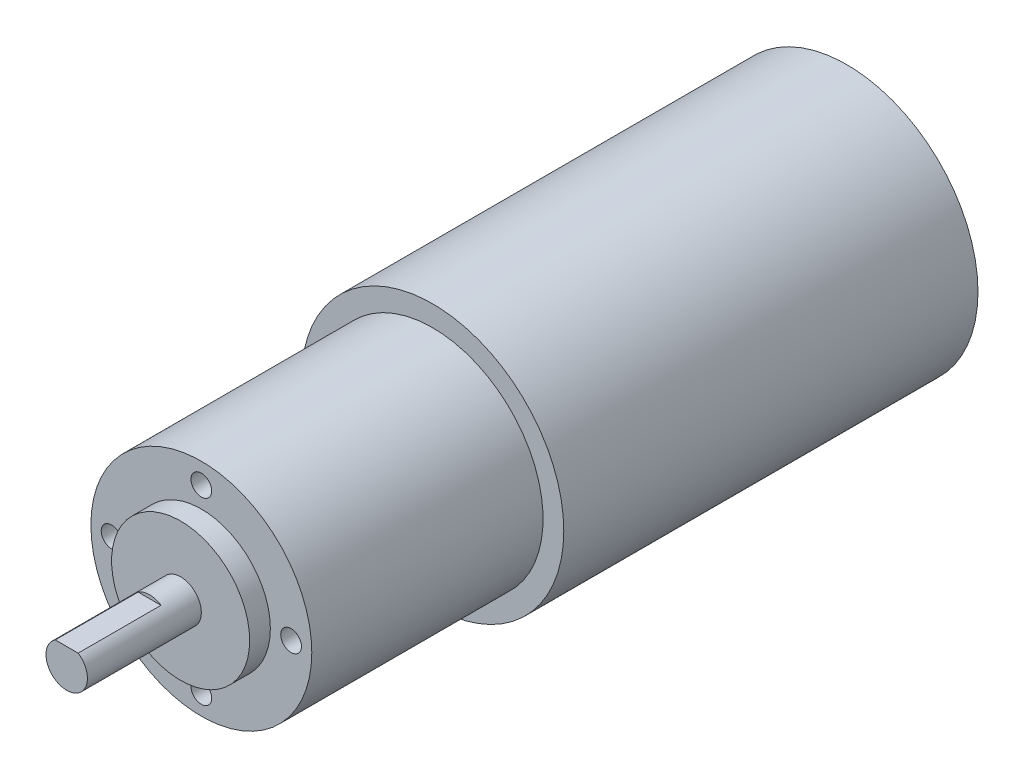
ISO-10303-21;
HEADER;
FILE_DESCRIPTION(('STEP AP214'),'2;1');
FILE_NAME('part.step','',(''),(''),'','','');
FILE_SCHEMA(('AUTOMOTIVE_DESIGN { 1 0 10303 214 1 1 1 1 }'));
ENDSEC;
DATA;
#1=APPLICATION_CONTEXT('core data for automotive mechanical design processes');
#2=APPLICATION_PROTOCOL_DEFINITION('international standard','automotive_design',2000,#1);
#3=PRODUCT_CONTEXT('',#1,'mechanical');
#4=PRODUCT('Part','Part','',(#3));
#5=PRODUCT_RELATED_PRODUCT_CATEGORY('part','',(#4));
#6=PRODUCT_DEFINITION_FORMATION('','',#4);
#7=PRODUCT_DEFINITION_CONTEXT('part definition',#1,'design');
#8=PRODUCT_DEFINITION('design','',#6,#7);
#9=PRODUCT_DEFINITION_SHAPE('','',#8);
#10=(LENGTH_UNIT() NAMED_UNIT(*) SI_UNIT(.MILLI.,.METRE.));
#11=(NAMED_UNIT(*) PLANE_ANGLE_UNIT() SI_UNIT($,.RADIAN.));
#12=(NAMED_UNIT(*) SI_UNIT($,.STERADIAN.) SOLID_ANGLE_UNIT());
#13=UNCERTAINTY_MEASURE_WITH_UNIT(LENGTH_MEASURE(1.E-05),#10,'distance_accuracy_value','');
#14=(GEOMETRIC_REPRESENTATION_CONTEXT(3) GLOBAL_UNCERTAINTY_ASSIGNED_CONTEXT((#13)) GLOBAL_UNIT_ASSIGNED_CONTEXT((#10,
#11,#12)) REPRESENTATION_CONTEXT('',''));
#15=CARTESIAN_POINT('',(0.,0.,0.));
#16=DIRECTION('',(0.,0.,1.));
#17=DIRECTION('',(1.,0.,0.));
#18=AXIS2_PLACEMENT_3D('',#15,#16,#17);
#19=CARTESIAN_POINT('',(0.,0.,53.));
#20=DIRECTION('',(0.,0.,-1.));
#21=DIRECTION('',(-1.,0.,0.));
#22=AXIS2_PLACEMENT_3D('',#19,#20,#21);
#23=CYLINDRICAL_SURFACE('',#22,3.);
#24=CARTESIAN_POINT('',(0.,0.,36.5));
#25=DIRECTION('',(0.,0.,1.));
#26=DIRECTION('',(1.,0.,0.));
#27=AXIS2_PLACEMENT_3D('',#24,#25,#26);
#28=CIRCLE('',#27,3.);
#29=CARTESIAN_POINT('',(3.,0.,36.5));
#30=VERTEX_POINT('',#29);
#31=EDGE_CURVE('E68',#30,#30,#28,.T.);
#32=ORIENTED_EDGE('',*,*,#31,.T.);
#33=EDGE_LOOP('',(#32));
#34=FACE_BOUND('',#33,.T.);
#35=DIRECTION('',(0.,0.,-1.));
#36=VECTOR('',#35,1.);
#37=CARTESIAN_POINT('',(-1.6583123951777,2.5,53.));
#38=LINE('',#37,#36);
#39=CARTESIAN_POINT('',(-1.6583123951777,2.5,41.));
#40=VERTEX_POINT('',#39);
#41=CARTESIAN_POINT('',(-1.6583123951777,2.5,53.));
#42=VERTEX_POINT('',#41);
#43=EDGE_CURVE('E49',#40,#42,#38,.F.);
#44=ORIENTED_EDGE('',*,*,#43,.F.);
#45=CARTESIAN_POINT('',(0.,0.,41.));
#46=DIRECTION('',(0.,0.,-1.));
#47=DIRECTION('',(-1.,0.,0.));
#48=AXIS2_PLACEMENT_3D('',#45,#46,#47);
#49=CIRCLE('',#48,3.);
#50=CARTESIAN_POINT('',(1.6583123951777,2.5,41.));
#51=VERTEX_POINT('',#50);
#52=EDGE_CURVE('E11',#40,#51,#49,.T.);
#53=ORIENTED_EDGE('',*,*,#52,.T.);
#54=DIRECTION('',(0.,0.,-1.));
#55=VECTOR('',#54,1.);
#56=CARTESIAN_POINT('',(1.6583123951777,2.5,53.));
#57=LINE('',#56,#55);
#58=CARTESIAN_POINT('',(1.6583123951777,2.5,53.));
#59=VERTEX_POINT('',#58);
#60=EDGE_CURVE('E61',#59,#51,#57,.T.);
#61=ORIENTED_EDGE('',*,*,#60,.F.);
#62=CARTESIAN_POINT('',(0.,0.,53.));
#63=DIRECTION('',(0.,0.,1.));
#64=DIRECTION('',(1.,0.,0.));
#65=AXIS2_PLACEMENT_3D('',#62,#63,#64);
#66=CIRCLE('',#65,3.);
#67=EDGE_CURVE('E67',#42,#59,#66,.T.);
#68=ORIENTED_EDGE('',*,*,#67,.F.);
#69=EDGE_LOOP('',(#44,#53,#61,#68));
#70=FACE_BOUND('',#69,.T.);
#71=ADVANCED_FACE('F34',(#34,#70),#23,.T.);
#72=CARTESIAN_POINT('',(0.,0.,53.));
#73=DIRECTION('',(0.,0.,1.));
#74=DIRECTION('',(1.,0.,0.));
#75=AXIS2_PLACEMENT_3D('',#72,#73,#74);
#76=PLANE('',#75);
#77=ORIENTED_EDGE('',*,*,#67,.T.);
#78=DIRECTION('',(-1.,0.,0.));
#79=VECTOR('',#78,1.);
#80=CARTESIAN_POINT('',(0.,2.5,53.));
#81=LINE('',#80,#79);
#82=EDGE_CURVE('E42',#59,#42,#81,.T.);
#83=ORIENTED_EDGE('',*,*,#82,.T.);
#84=EDGE_LOOP('',(#77,#83));
#85=FACE_BOUND('',#84,.T.);
#86=ADVANCED_FACE('F70',(#85),#76,.T.);
#87=CARTESIAN_POINT('',(0.,0.,36.5));
#88=DIRECTION('',(0.,0.,1.));
#89=DIRECTION('',(1.,0.,0.));
#90=AXIS2_PLACEMENT_3D('',#87,#88,#89);
#91=PLANE('',#90);
#92=CARTESIAN_POINT('',(0.,0.,36.5));
#93=DIRECTION('',(0.,0.,1.));
#94=DIRECTION('',(1.,0.,0.));
#95=AXIS2_PLACEMENT_3D('',#92,#93,#94);
#96=CIRCLE('',#95,10.);
#97=CARTESIAN_POINT('',(10.,0.,36.5));
#98=VERTEX_POINT('',#97);
#99=EDGE_CURVE('E74',#98,#98,#96,.T.);
#100=ORIENTED_EDGE('',*,*,#99,.T.);
#101=EDGE_LOOP('',(#100));
#102=FACE_BOUND('',#101,.T.);
#103=ORIENTED_EDGE('',*,*,#31,.F.);
#104=EDGE_LOOP('',(#103));
#105=FACE_BOUND('',#104,.T.);
#106=ADVANCED_FACE('F141',(#102,#105),#91,.T.);
#107=CARTESIAN_POINT('',(0.,0.,33.5));
#108=DIRECTION('',(0.,0.,1.));
#109=DIRECTION('',(1.,0.,0.));
#110=AXIS2_PLACEMENT_3D('',#107,#108,#109);
#111=PLANE('',#110);
#112=CARTESIAN_POINT('',(0.,-13.,33.5));
#113=DIRECTION('',(0.,0.,1.));
#114=DIRECTION('',(-1.,0.,0.));
#115=AXIS2_PLACEMENT_3D('',#112,#113,#114);
#116=CIRCLE('',#115,1.5);
#117=CARTESIAN_POINT('',(-1.5,-13.,33.5));
#118=VERTEX_POINT('',#117);
#119=EDGE_CURVE('E124',#118,#118,#116,.T.);
#120=ORIENTED_EDGE('',*,*,#119,.F.);
#121=EDGE_LOOP('',(#120));
#122=FACE_BOUND('',#121,.T.);
#123=CARTESIAN_POINT('',(13.,0.,33.5));
#124=DIRECTION('',(0.,0.,1.));
#125=DIRECTION('',(-1.,0.,0.));
#126=AXIS2_PLACEMENT_3D('',#123,#124,#125);
#127=CIRCLE('',#126,1.5);
#128=CARTESIAN_POINT('',(11.5,0.,33.5));
#129=VERTEX_POINT('',#128);
#130=EDGE_CURVE('E118',#129,#129,#127,.T.);
#131=ORIENTED_EDGE('',*,*,#130,.F.);
#132=EDGE_LOOP('',(#131));
#133=FACE_BOUND('',#132,.T.);
#134=CARTESIAN_POINT('',(-13.,0.,33.5));
#135=DIRECTION('',(0.,0.,1.));
#136=DIRECTION('',(1.,0.,0.));
#137=AXIS2_PLACEMENT_3D('',#134,#135,#136);
#138=CIRCLE('',#137,1.5);
#139=CARTESIAN_POINT('',(-11.5,0.,33.5));
#140=VERTEX_POINT('',#139);
#141=EDGE_CURVE('E112',#140,#140,#138,.T.);
#142=ORIENTED_EDGE('',*,*,#141,.F.);
#143=EDGE_LOOP('',(#142));
#144=FACE_BOUND('',#143,.T.);
#145=CARTESIAN_POINT('',(0.,13.,33.5));
#146=DIRECTION('',(0.,0.,1.));
#147=DIRECTION('',(1.,0.,0.));
#148=AXIS2_PLACEMENT_3D('',#145,#146,#147);
#149=CIRCLE('',#148,1.5);
#150=CARTESIAN_POINT('',(1.5,13.,33.5));
#151=VERTEX_POINT('',#150);
#152=EDGE_CURVE('E106',#151,#151,#149,.T.);
#153=ORIENTED_EDGE('',*,*,#152,.F.);
#154=EDGE_LOOP('',(#153));
#155=FACE_BOUND('',#154,.T.);
#156=CARTESIAN_POINT('',(0.,0.,33.5));
#157=DIRECTION('',(0.,0.,1.));
#158=DIRECTION('',(1.,0.,0.));
#159=AXIS2_PLACEMENT_3D('',#156,#157,#158);
#160=CIRCLE('',#159,16.);
#161=CARTESIAN_POINT('',(16.,0.,33.5));
#162=VERTEX_POINT('',#161);
#163=EDGE_CURVE('E65',#162,#162,#160,.T.);
#164=ORIENTED_EDGE('',*,*,#163,.T.);
#165=EDGE_LOOP('',(#164));
#166=FACE_BOUND('',#165,.T.);
#167=CARTESIAN_POINT('',(0.,0.,33.5));
#168=DIRECTION('',(0.,0.,1.));
#169=DIRECTION('',(1.,0.,0.));
#170=AXIS2_PLACEMENT_3D('',#167,#168,#169);
#171=CIRCLE('',#170,10.);
#172=CARTESIAN_POINT('',(10.,0.,33.5));
#173=VERTEX_POINT('',#172);
#174=EDGE_CURVE('E71',#173,#173,#171,.T.);
#175=ORIENTED_EDGE('',*,*,#174,.F.);
#176=EDGE_LOOP('',(#175));
#177=FACE_BOUND('',#176,.T.);
#178=ADVANCED_FACE('F85',(#122,#133,#144,#155,#166,#177),#111,.T.);
#179=CARTESIAN_POINT('',(0.,0.,33.5));
#180=DIRECTION('',(0.,0.,-1.));
#181=DIRECTION('',(-1.,0.,0.));
#182=AXIS2_PLACEMENT_3D('',#179,#180,#181);
#183=CYLINDRICAL_SURFACE('',#182,16.);
#184=ORIENTED_EDGE('',*,*,#163,.F.);
#185=EDGE_LOOP('',(#184));
#186=FACE_BOUND('',#185,.T.);
#187=CARTESIAN_POINT('',(0.,0.,0.));
#188=DIRECTION('',(0.,0.,-1.));
#189=DIRECTION('',(-1.,0.,0.));
#190=AXIS2_PLACEMENT_3D('',#187,#188,#189);
#191=CIRCLE('',#190,16.);
#192=CARTESIAN_POINT('',(-16.,0.,0.));
#193=VERTEX_POINT('',#192);
#194=EDGE_CURVE('E93',#193,#193,#191,.T.);
#195=ORIENTED_EDGE('',*,*,#194,.F.);
#196=EDGE_LOOP('',(#195));
#197=FACE_BOUND('',#196,.T.);
#198=ADVANCED_FACE('F36',(#186,#197),#183,.T.);
#199=CARTESIAN_POINT('',(0.,0.,36.5));
#200=DIRECTION('',(0.,0.,-1.));
#201=DIRECTION('',(-1.,0.,0.));
#202=AXIS2_PLACEMENT_3D('',#199,#200,#201);
#203=CYLINDRICAL_SURFACE('',#202,10.);
#204=ORIENTED_EDGE('',*,*,#99,.F.);
#205=EDGE_LOOP('',(#204));
#206=FACE_BOUND('',#205,.T.);
#207=ORIENTED_EDGE('',*,*,#174,.T.);
#208=EDGE_LOOP('',(#207));
#209=FACE_BOUND('',#208,.T.);
#210=ADVANCED_FACE('F90',(#206,#209),#203,.T.);
#211=CARTESIAN_POINT('',(-4.62178809809188,2.5,41.));
#212=DIRECTION('',(0.,0.,-1.));
#213=DIRECTION('',(-1.,0.,0.));
#214=AXIS2_PLACEMENT_3D('',#211,#212,#213);
#215=PLANE('',#214);
#216=DIRECTION('',(-1.,0.,0.));
#217=VECTOR('',#216,1.);
#218=CARTESIAN_POINT('',(-4.62178809809188,2.5,41.));
#219=LINE('',#218,#217);
#220=EDGE_CURVE('E95',#51,#40,#219,.T.);
#221=ORIENTED_EDGE('',*,*,#220,.F.);
#222=ORIENTED_EDGE('',*,*,#52,.F.);
#223=EDGE_LOOP('',(#221,#222));
#224=FACE_BOUND('',#223,.T.);
#225=ADVANCED_FACE('F178',(#224),#215,.F.);
#226=CARTESIAN_POINT('',(4.62178809809189,2.5,53.));
#227=DIRECTION('',(0.,1.,0.));
#228=DIRECTION('',(0.,0.,1.));
#229=AXIS2_PLACEMENT_3D('',#226,#227,#228);
#230=PLANE('',#229);
#231=ORIENTED_EDGE('',*,*,#60,.T.);
#232=ORIENTED_EDGE('',*,*,#220,.T.);
#233=ORIENTED_EDGE('',*,*,#43,.T.);
#234=ORIENTED_EDGE('',*,*,#82,.F.);
#235=EDGE_LOOP('',(#231,#232,#233,#234));
#236=FACE_BOUND('',#235,.T.);
#237=ADVANCED_FACE('F60',(#236),#230,.T.);
#238=CARTESIAN_POINT('',(0.,0.,0.));
#239=DIRECTION('',(0.,0.,-1.));
#240=DIRECTION('',(-1.,0.,0.));
#241=AXIS2_PLACEMENT_3D('',#238,#239,#240);
#242=PLANE('',#241);
#243=CARTESIAN_POINT('',(0.,0.,0.));
#244=DIRECTION('',(0.,0.,-1.));
#245=DIRECTION('',(-1.,0.,0.));
#246=AXIS2_PLACEMENT_3D('',#243,#244,#245);
#247=CIRCLE('',#246,19.);
#248=CARTESIAN_POINT('',(-19.,0.,0.));
#249=VERTEX_POINT('',#248);
#250=EDGE_CURVE('E100',#249,#249,#247,.T.);
#251=ORIENTED_EDGE('',*,*,#250,.F.);
#252=EDGE_LOOP('',(#251));
#253=FACE_BOUND('',#252,.T.);
#254=ORIENTED_EDGE('',*,*,#194,.T.);
#255=EDGE_LOOP('',(#254));
#256=FACE_BOUND('',#255,.T.);
#257=ADVANCED_FACE('F191',(#253,#256),#242,.F.);
#258=CARTESIAN_POINT('',(0.,0.,-60.));
#259=DIRECTION('',(0.,0.,1.));
#260=DIRECTION('',(1.,0.,0.));
#261=AXIS2_PLACEMENT_3D('',#258,#259,#260);
#262=CYLINDRICAL_SURFACE('',#261,19.);
#263=CARTESIAN_POINT('',(0.,0.,-60.));
#264=DIRECTION('',(0.,0.,-1.));
#265=DIRECTION('',(-1.,0.,0.));
#266=AXIS2_PLACEMENT_3D('',#263,#264,#265);
#267=CIRCLE('',#266,19.);
#268=CARTESIAN_POINT('',(-19.,0.,-60.));
#269=VERTEX_POINT('',#268);
#270=EDGE_CURVE('E96',#269,#269,#267,.T.);
#271=ORIENTED_EDGE('',*,*,#270,.F.);
#272=EDGE_LOOP('',(#271));
#273=FACE_BOUND('',#272,.T.);
#274=ORIENTED_EDGE('',*,*,#250,.T.);
#275=EDGE_LOOP('',(#274));
#276=FACE_BOUND('',#275,.T.);
#277=ADVANCED_FACE('F161',(#273,#276),#262,.T.);
#278=CARTESIAN_POINT('',(0.,0.,-60.));
#279=DIRECTION('',(0.,0.,-1.));
#280=DIRECTION('',(-1.,0.,0.));
#281=AXIS2_PLACEMENT_3D('',#278,#279,#280);
#282=PLANE('',#281);
#283=ORIENTED_EDGE('',*,*,#270,.T.);
#284=EDGE_LOOP('',(#283));
#285=FACE_BOUND('',#284,.T.);
#286=ADVANCED_FACE('F151',(#285),#282,.T.);
#287=CARTESIAN_POINT('',(0.,13.,28.5));
#288=DIRECTION('',(0.,0.,1.));
#289=DIRECTION('',(1.,0.,0.));
#290=AXIS2_PLACEMENT_3D('',#287,#288,#289);
#291=CYLINDRICAL_SURFACE('',#290,1.5);
#292=CARTESIAN_POINT('',(0.,13.,28.5));
#293=DIRECTION('',(0.,0.,1.));
#294=DIRECTION('',(1.,0.,0.));
#295=AXIS2_PLACEMENT_3D('',#292,#293,#294);
#296=CIRCLE('',#295,1.5);
#297=CARTESIAN_POINT('',(1.5,13.,28.5));
#298=VERTEX_POINT('',#297);
#299=EDGE_CURVE('E104',#298,#298,#296,.T.);
#300=ORIENTED_EDGE('',*,*,#299,.F.);
#301=EDGE_LOOP('',(#300));
#302=FACE_BOUND('',#301,.T.);
#303=ORIENTED_EDGE('',*,*,#152,.T.);
#304=EDGE_LOOP('',(#303));
#305=FACE_BOUND('',#304,.T.);
#306=ADVANCED_FACE('F148',(#302,#305),#291,.F.);
#307=CARTESIAN_POINT('',(0.,13.,28.5));
#308=DIRECTION('',(0.,0.,1.));
#309=DIRECTION('',(1.,0.,0.));
#310=AXIS2_PLACEMENT_3D('',#307,#308,#309);
#311=PLANE('',#310);
#312=ORIENTED_EDGE('',*,*,#299,.T.);
#313=EDGE_LOOP('',(#312));
#314=FACE_BOUND('',#313,.T.);
#315=ADVANCED_FACE('F150',(#314),#311,.T.);
#316=CARTESIAN_POINT('',(-13.,0.,28.5));
#317=DIRECTION('',(0.,0.,1.));
#318=DIRECTION('',(1.,0.,0.));
#319=AXIS2_PLACEMENT_3D('',#316,#317,#318);
#320=CYLINDRICAL_SURFACE('',#319,1.5);
#321=CARTESIAN_POINT('',(-13.,0.,28.5));
#322=DIRECTION('',(0.,0.,1.));
#323=DIRECTION('',(1.,0.,0.));
#324=AXIS2_PLACEMENT_3D('',#321,#322,#323);
#325=CIRCLE('',#324,1.5);
#326=CARTESIAN_POINT('',(-11.5,0.,28.5));
#327=VERTEX_POINT('',#326);
#328=EDGE_CURVE('E109',#327,#327,#325,.T.);
#329=ORIENTED_EDGE('',*,*,#328,.F.);
#330=EDGE_LOOP('',(#329));
#331=FACE_BOUND('',#330,.T.);
#332=ORIENTED_EDGE('',*,*,#141,.T.);
#333=EDGE_LOOP('',(#332));
#334=FACE_BOUND('',#333,.T.);
#335=ADVANCED_FACE('F158',(#331,#334),#320,.F.);
#336=CARTESIAN_POINT('',(-13.,0.,28.5));
#337=DIRECTION('',(0.,0.,1.));
#338=DIRECTION('',(1.,0.,0.));
#339=AXIS2_PLACEMENT_3D('',#336,#337,#338);
#340=PLANE('',#339);
#341=ORIENTED_EDGE('',*,*,#328,.T.);
#342=EDGE_LOOP('',(#341));
#343=FACE_BOUND('',#342,.T.);
#344=ADVANCED_FACE('F240',(#343),#340,.T.);
#345=CARTESIAN_POINT('',(13.,0.,28.5));
#346=DIRECTION('',(0.,0.,1.));
#347=DIRECTION('',(1.,0.,0.));
#348=AXIS2_PLACEMENT_3D('',#345,#346,#347);
#349=CYLINDRICAL_SURFACE('',#348,1.5);
#350=CARTESIAN_POINT('',(13.,0.,28.5));
#351=DIRECTION('',(0.,0.,1.));
#352=DIRECTION('',(-1.,0.,0.));
#353=AXIS2_PLACEMENT_3D('',#350,#351,#352);
#354=CIRCLE('',#353,1.5);
#355=CARTESIAN_POINT('',(11.5,0.,28.5));
#356=VERTEX_POINT('',#355);
#357=EDGE_CURVE('E115',#356,#356,#354,.T.);
#358=ORIENTED_EDGE('',*,*,#357,.F.);
#359=EDGE_LOOP('',(#358));
#360=FACE_BOUND('',#359,.T.);
#361=ORIENTED_EDGE('',*,*,#130,.T.);
#362=EDGE_LOOP('',(#361));
#363=FACE_BOUND('',#362,.T.);
#364=ADVANCED_FACE('F250',(#360,#363),#349,.F.);
#365=CARTESIAN_POINT('',(13.,0.,28.5));
#366=DIRECTION('',(0.,0.,-1.));
#367=DIRECTION('',(-1.,0.,0.));
#368=AXIS2_PLACEMENT_3D('',#365,#366,#367);
#369=PLANE('',#368);
#370=ORIENTED_EDGE('',*,*,#357,.T.);
#371=EDGE_LOOP('',(#370));
#372=FACE_BOUND('',#371,.T.);
#373=ADVANCED_FACE('F135',(#372),#369,.F.);
#374=CARTESIAN_POINT('',(0.,-13.,28.5));
#375=DIRECTION('',(0.,0.,1.));
#376=DIRECTION('',(1.,0.,0.));
#377=AXIS2_PLACEMENT_3D('',#374,#375,#376);
#378=CYLINDRICAL_SURFACE('',#377,1.5);
#379=CARTESIAN_POINT('',(0.,-13.,28.5));
#380=DIRECTION('',(0.,0.,1.));
#381=DIRECTION('',(-1.,0.,0.));
#382=AXIS2_PLACEMENT_3D('',#379,#380,#381);
#383=CIRCLE('',#382,1.5);
#384=CARTESIAN_POINT('',(-1.5,-13.,28.5));
#385=VERTEX_POINT('',#384);
#386=EDGE_CURVE('E121',#385,#385,#383,.T.);
#387=ORIENTED_EDGE('',*,*,#386,.F.);
#388=EDGE_LOOP('',(#387));
#389=FACE_BOUND('',#388,.T.);
#390=ORIENTED_EDGE('',*,*,#119,.T.);
#391=EDGE_LOOP('',(#390));
#392=FACE_BOUND('',#391,.T.);
#393=ADVANCED_FACE('F132',(#389,#392),#378,.F.);
#394=CARTESIAN_POINT('',(0.,-13.,28.5));
#395=DIRECTION('',(0.,0.,-1.));
#396=DIRECTION('',(-1.,0.,0.));
#397=AXIS2_PLACEMENT_3D('',#394,#395,#396);
#398=PLANE('',#397);
#399=ORIENTED_EDGE('',*,*,#386,.T.);
#400=EDGE_LOOP('',(#399));
#401=FACE_BOUND('',#400,.T.);
#402=ADVANCED_FACE('F130',(#401),#398,.F.);
#403=CLOSED_SHELL('',(#71,#86,#106,#178,#198,#210,#225,#237,#257,#277,#286,#306,#315,#335,#344,
#364,#373,#393,#402));
#404=MANIFOLD_SOLID_BREP('B2',#403);
#405=ADVANCED_BREP_SHAPE_REPRESENTATION('',(#18,#404),#14);
#406=SHAPE_DEFINITION_REPRESENTATION(#9,#405);
ENDSEC;
END-ISO-10303-21;
